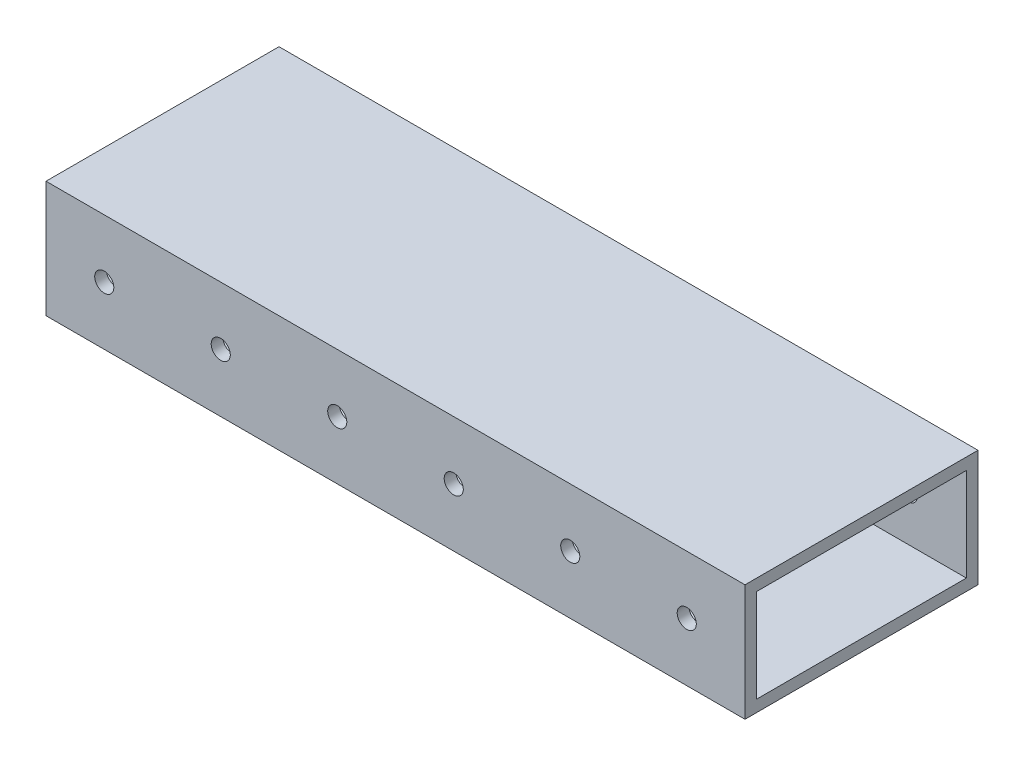
ISO-10303-21;
HEADER;
FILE_DESCRIPTION(('STEP AP214'),'2;1');
FILE_NAME('part.step','',(''),(''),'','','');
FILE_SCHEMA(('AUTOMOTIVE_DESIGN { 1 0 10303 214 1 1 1 1 }'));
ENDSEC;
DATA;
#1=APPLICATION_CONTEXT('core data for automotive mechanical design processes');
#2=APPLICATION_PROTOCOL_DEFINITION('international standard','automotive_design',2000,#1);
#3=PRODUCT_CONTEXT('',#1,'mechanical');
#4=PRODUCT('Part','Part','',(#3));
#5=PRODUCT_RELATED_PRODUCT_CATEGORY('part','',(#4));
#6=PRODUCT_DEFINITION_FORMATION('','',#4);
#7=PRODUCT_DEFINITION_CONTEXT('part definition',#1,'design');
#8=PRODUCT_DEFINITION('design','',#6,#7);
#9=PRODUCT_DEFINITION_SHAPE('','',#8);
#10=(LENGTH_UNIT() NAMED_UNIT(*) SI_UNIT(.MILLI.,.METRE.));
#11=(NAMED_UNIT(*) PLANE_ANGLE_UNIT() SI_UNIT($,.RADIAN.));
#12=(NAMED_UNIT(*) SI_UNIT($,.STERADIAN.) SOLID_ANGLE_UNIT());
#13=UNCERTAINTY_MEASURE_WITH_UNIT(LENGTH_MEASURE(1.E-05),#10,'distance_accuracy_value','');
#14=(GEOMETRIC_REPRESENTATION_CONTEXT(3) GLOBAL_UNCERTAINTY_ASSIGNED_CONTEXT((#13)) GLOBAL_UNIT_ASSIGNED_CONTEXT((#10,
#11,#12)) REPRESENTATION_CONTEXT('',''));
#15=CARTESIAN_POINT('',(0.,0.,0.));
#16=DIRECTION('',(0.,0.,1.));
#17=DIRECTION('',(1.,0.,0.));
#18=AXIS2_PLACEMENT_3D('',#15,#16,#17);
#19=CARTESIAN_POINT('',(-38.1,0.,-137.239355630794));
#20=DIRECTION('',(0.,0.,1.));
#21=DIRECTION('',(1.,0.,0.));
#22=AXIS2_PLACEMENT_3D('',#19,#20,#21);
#23=CYLINDRICAL_SURFACE('',#22,2.0828);
#24=CARTESIAN_POINT('',(-38.1,0.,22.86));
#25=DIRECTION('',(0.,0.,1.));
#26=DIRECTION('',(1.,0.,0.));
#27=AXIS2_PLACEMENT_3D('',#24,#25,#26);
#28=CIRCLE('',#27,2.0828);
#29=CARTESIAN_POINT('',(-36.0172,0.,22.86));
#30=VERTEX_POINT('',#29);
#31=EDGE_CURVE('E121',#30,#30,#28,.F.);
#32=ORIENTED_EDGE('',*,*,#31,.T.);
#33=EDGE_LOOP('',(#32));
#34=FACE_BOUND('',#33,.T.);
#35=CARTESIAN_POINT('',(-38.1,0.,25.4));
#36=DIRECTION('',(0.,0.,1.));
#37=DIRECTION('',(1.,0.,0.));
#38=AXIS2_PLACEMENT_3D('',#35,#36,#37);
#39=CIRCLE('',#38,2.0828);
#40=CARTESIAN_POINT('',(-36.0172,0.,25.4));
#41=VERTEX_POINT('',#40);
#42=EDGE_CURVE('E116',#41,#41,#39,.F.);
#43=ORIENTED_EDGE('',*,*,#42,.F.);
#44=EDGE_LOOP('',(#43));
#45=FACE_BOUND('',#44,.T.);
#46=ADVANCED_FACE('F17',(#34,#45),#23,.F.);
#47=CARTESIAN_POINT('',(12.7,0.,-137.239355630794));
#48=DIRECTION('',(0.,0.,1.));
#49=DIRECTION('',(1.,0.,0.));
#50=AXIS2_PLACEMENT_3D('',#47,#48,#49);
#51=CYLINDRICAL_SURFACE('',#50,2.0828);
#52=CARTESIAN_POINT('',(12.7,0.,22.86));
#53=DIRECTION('',(0.,0.,1.));
#54=DIRECTION('',(1.,0.,0.));
#55=AXIS2_PLACEMENT_3D('',#52,#53,#54);
#56=CIRCLE('',#55,2.0828);
#57=CARTESIAN_POINT('',(14.7828,0.,22.86));
#58=VERTEX_POINT('',#57);
#59=EDGE_CURVE('E170',#58,#58,#56,.F.);
#60=ORIENTED_EDGE('',*,*,#59,.T.);
#61=EDGE_LOOP('',(#60));
#62=FACE_BOUND('',#61,.T.);
#63=CARTESIAN_POINT('',(12.7,0.,25.4));
#64=DIRECTION('',(0.,0.,1.));
#65=DIRECTION('',(1.,0.,0.));
#66=AXIS2_PLACEMENT_3D('',#63,#64,#65);
#67=CIRCLE('',#66,2.0828);
#68=CARTESIAN_POINT('',(14.7828,0.,25.4));
#69=VERTEX_POINT('',#68);
#70=EDGE_CURVE('E154',#69,#69,#67,.F.);
#71=ORIENTED_EDGE('',*,*,#70,.F.);
#72=EDGE_LOOP('',(#71));
#73=FACE_BOUND('',#72,.T.);
#74=ADVANCED_FACE('F258',(#62,#73),#51,.F.);
#75=CARTESIAN_POINT('',(63.5,0.,-137.239355630794));
#76=DIRECTION('',(0.,0.,1.));
#77=DIRECTION('',(1.,0.,0.));
#78=AXIS2_PLACEMENT_3D('',#75,#76,#77);
#79=CYLINDRICAL_SURFACE('',#78,2.0828);
#80=CARTESIAN_POINT('',(63.5,0.,22.86));
#81=DIRECTION('',(0.,0.,1.));
#82=DIRECTION('',(1.,0.,0.));
#83=AXIS2_PLACEMENT_3D('',#80,#81,#82);
#84=CIRCLE('',#83,2.0828);
#85=CARTESIAN_POINT('',(65.5828,0.,22.86));
#86=VERTEX_POINT('',#85);
#87=EDGE_CURVE('E167',#86,#86,#84,.F.);
#88=ORIENTED_EDGE('',*,*,#87,.T.);
#89=EDGE_LOOP('',(#88));
#90=FACE_BOUND('',#89,.T.);
#91=CARTESIAN_POINT('',(63.5,0.,25.4));
#92=DIRECTION('',(0.,0.,1.));
#93=DIRECTION('',(1.,0.,0.));
#94=AXIS2_PLACEMENT_3D('',#91,#92,#93);
#95=CIRCLE('',#94,2.0828);
#96=CARTESIAN_POINT('',(65.5828,0.,25.4));
#97=VERTEX_POINT('',#96);
#98=EDGE_CURVE('E151',#97,#97,#95,.F.);
#99=ORIENTED_EDGE('',*,*,#98,.F.);
#100=EDGE_LOOP('',(#99));
#101=FACE_BOUND('',#100,.T.);
#102=ADVANCED_FACE('F264',(#90,#101),#79,.F.);
#103=CARTESIAN_POINT('',(38.1,0.,-137.239355630794));
#104=DIRECTION('',(0.,0.,1.));
#105=DIRECTION('',(1.,0.,0.));
#106=AXIS2_PLACEMENT_3D('',#103,#104,#105);
#107=CYLINDRICAL_SURFACE('',#106,2.0828);
#108=CARTESIAN_POINT('',(38.1,0.,22.86));
#109=DIRECTION('',(0.,0.,1.));
#110=DIRECTION('',(1.,0.,0.));
#111=AXIS2_PLACEMENT_3D('',#108,#109,#110);
#112=CIRCLE('',#111,2.0828);
#113=CARTESIAN_POINT('',(40.1828,0.,22.86));
#114=VERTEX_POINT('',#113);
#115=EDGE_CURVE('E164',#114,#114,#112,.F.);
#116=ORIENTED_EDGE('',*,*,#115,.T.);
#117=EDGE_LOOP('',(#116));
#118=FACE_BOUND('',#117,.T.);
#119=CARTESIAN_POINT('',(38.1,0.,25.4));
#120=DIRECTION('',(0.,0.,1.));
#121=DIRECTION('',(1.,0.,0.));
#122=AXIS2_PLACEMENT_3D('',#119,#120,#121);
#123=CIRCLE('',#122,2.0828);
#124=CARTESIAN_POINT('',(40.1828,0.,25.4));
#125=VERTEX_POINT('',#124);
#126=EDGE_CURVE('E148',#125,#125,#123,.F.);
#127=ORIENTED_EDGE('',*,*,#126,.F.);
#128=EDGE_LOOP('',(#127));
#129=FACE_BOUND('',#128,.T.);
#130=ADVANCED_FACE('F269',(#118,#129),#107,.F.);
#131=CARTESIAN_POINT('',(-12.7,0.,-137.239355630794));
#132=DIRECTION('',(0.,0.,1.));
#133=DIRECTION('',(1.,0.,0.));
#134=AXIS2_PLACEMENT_3D('',#131,#132,#133);
#135=CYLINDRICAL_SURFACE('',#134,2.0828);
#136=CARTESIAN_POINT('',(-12.7,0.,22.86));
#137=DIRECTION('',(0.,0.,1.));
#138=DIRECTION('',(1.,0.,0.));
#139=AXIS2_PLACEMENT_3D('',#136,#137,#138);
#140=CIRCLE('',#139,2.0828);
#141=CARTESIAN_POINT('',(-10.6172,0.,22.86));
#142=VERTEX_POINT('',#141);
#143=EDGE_CURVE('E161',#142,#142,#140,.F.);
#144=ORIENTED_EDGE('',*,*,#143,.T.);
#145=EDGE_LOOP('',(#144));
#146=FACE_BOUND('',#145,.T.);
#147=CARTESIAN_POINT('',(-12.7,0.,25.4));
#148=DIRECTION('',(0.,0.,1.));
#149=DIRECTION('',(1.,0.,0.));
#150=AXIS2_PLACEMENT_3D('',#147,#148,#149);
#151=CIRCLE('',#150,2.0828);
#152=CARTESIAN_POINT('',(-10.6172,0.,25.4));
#153=VERTEX_POINT('',#152);
#154=EDGE_CURVE('E145',#153,#153,#151,.F.);
#155=ORIENTED_EDGE('',*,*,#154,.F.);
#156=EDGE_LOOP('',(#155));
#157=FACE_BOUND('',#156,.T.);
#158=ADVANCED_FACE('F276',(#146,#157),#135,.F.);
#159=CARTESIAN_POINT('',(-63.5,0.,-137.239355630794));
#160=DIRECTION('',(0.,0.,1.));
#161=DIRECTION('',(1.,0.,0.));
#162=AXIS2_PLACEMENT_3D('',#159,#160,#161);
#163=CYLINDRICAL_SURFACE('',#162,2.0828);
#164=CARTESIAN_POINT('',(-63.5,0.,22.86));
#165=DIRECTION('',(0.,0.,1.));
#166=DIRECTION('',(1.,0.,0.));
#167=AXIS2_PLACEMENT_3D('',#164,#165,#166);
#168=CIRCLE('',#167,2.0828);
#169=CARTESIAN_POINT('',(-61.4172,0.,22.86));
#170=VERTEX_POINT('',#169);
#171=EDGE_CURVE('E119',#170,#170,#168,.F.);
#172=ORIENTED_EDGE('',*,*,#171,.T.);
#173=EDGE_LOOP('',(#172));
#174=FACE_BOUND('',#173,.T.);
#175=CARTESIAN_POINT('',(-63.5,0.,25.4));
#176=DIRECTION('',(0.,0.,1.));
#177=DIRECTION('',(1.,0.,0.));
#178=AXIS2_PLACEMENT_3D('',#175,#176,#177);
#179=CIRCLE('',#178,2.0828);
#180=CARTESIAN_POINT('',(-61.4172,0.,25.4));
#181=VERTEX_POINT('',#180);
#182=EDGE_CURVE('E112',#181,#181,#179,.F.);
#183=ORIENTED_EDGE('',*,*,#182,.F.);
#184=EDGE_LOOP('',(#183));
#185=FACE_BOUND('',#184,.T.);
#186=ADVANCED_FACE('F280',(#174,#185),#163,.F.);
#187=CARTESIAN_POINT('',(-38.1,0.,-137.239355630794));
#188=DIRECTION('',(0.,0.,1.));
#189=DIRECTION('',(1.,0.,0.));
#190=AXIS2_PLACEMENT_3D('',#187,#188,#189);
#191=CYLINDRICAL_SURFACE('',#190,2.0828);
#192=CARTESIAN_POINT('',(-38.1,0.,-25.4));
#193=DIRECTION('',(0.,0.,1.));
#194=DIRECTION('',(1.,0.,0.));
#195=AXIS2_PLACEMENT_3D('',#192,#193,#194);
#196=CIRCLE('',#195,2.0828);
#197=CARTESIAN_POINT('',(-36.0172,0.,-25.4));
#198=VERTEX_POINT('',#197);
#199=EDGE_CURVE('E139',#198,#198,#196,.T.);
#200=ORIENTED_EDGE('',*,*,#199,.F.);
#201=EDGE_LOOP('',(#200));
#202=FACE_BOUND('',#201,.T.);
#203=CARTESIAN_POINT('',(-38.1,0.,-22.86));
#204=DIRECTION('',(0.,0.,1.));
#205=DIRECTION('',(1.,0.,0.));
#206=AXIS2_PLACEMENT_3D('',#203,#204,#205);
#207=CIRCLE('',#206,2.0828);
#208=CARTESIAN_POINT('',(-36.0172,0.,-22.86));
#209=VERTEX_POINT('',#208);
#210=EDGE_CURVE('E20',#209,#209,#207,.T.);
#211=ORIENTED_EDGE('',*,*,#210,.T.);
#212=EDGE_LOOP('',(#211));
#213=FACE_BOUND('',#212,.T.);
#214=ADVANCED_FACE('F192',(#202,#213),#191,.F.);
#215=CARTESIAN_POINT('',(12.7,0.,-137.239355630794));
#216=DIRECTION('',(0.,0.,1.));
#217=DIRECTION('',(1.,0.,0.));
#218=AXIS2_PLACEMENT_3D('',#215,#216,#217);
#219=CYLINDRICAL_SURFACE('',#218,2.0828);
#220=CARTESIAN_POINT('',(12.7,0.,-25.4));
#221=DIRECTION('',(0.,0.,1.));
#222=DIRECTION('',(1.,0.,0.));
#223=AXIS2_PLACEMENT_3D('',#220,#221,#222);
#224=CIRCLE('',#223,2.0828);
#225=CARTESIAN_POINT('',(14.7828,0.,-25.4));
#226=VERTEX_POINT('',#225);
#227=EDGE_CURVE('E136',#226,#226,#224,.T.);
#228=ORIENTED_EDGE('',*,*,#227,.F.);
#229=EDGE_LOOP('',(#228));
#230=FACE_BOUND('',#229,.T.);
#231=CARTESIAN_POINT('',(12.7,0.,-22.86));
#232=DIRECTION('',(0.,0.,1.));
#233=DIRECTION('',(1.,0.,0.));
#234=AXIS2_PLACEMENT_3D('',#231,#232,#233);
#235=CIRCLE('',#234,2.0828);
#236=CARTESIAN_POINT('',(14.7828,0.,-22.86));
#237=VERTEX_POINT('',#236);
#238=EDGE_CURVE('E185',#237,#237,#235,.T.);
#239=ORIENTED_EDGE('',*,*,#238,.T.);
#240=EDGE_LOOP('',(#239));
#241=FACE_BOUND('',#240,.T.);
#242=ADVANCED_FACE('F287',(#230,#241),#219,.F.);
#243=CARTESIAN_POINT('',(63.5,0.,-137.239355630794));
#244=DIRECTION('',(0.,0.,1.));
#245=DIRECTION('',(1.,0.,0.));
#246=AXIS2_PLACEMENT_3D('',#243,#244,#245);
#247=CYLINDRICAL_SURFACE('',#246,2.0828);
#248=CARTESIAN_POINT('',(63.5,0.,-25.4));
#249=DIRECTION('',(0.,0.,1.));
#250=DIRECTION('',(1.,0.,0.));
#251=AXIS2_PLACEMENT_3D('',#248,#249,#250);
#252=CIRCLE('',#251,2.0828);
#253=CARTESIAN_POINT('',(65.5828,0.,-25.4));
#254=VERTEX_POINT('',#253);
#255=EDGE_CURVE('E133',#254,#254,#252,.T.);
#256=ORIENTED_EDGE('',*,*,#255,.F.);
#257=EDGE_LOOP('',(#256));
#258=FACE_BOUND('',#257,.T.);
#259=CARTESIAN_POINT('',(63.5,0.,-22.86));
#260=DIRECTION('',(0.,0.,1.));
#261=DIRECTION('',(1.,0.,0.));
#262=AXIS2_PLACEMENT_3D('',#259,#260,#261);
#263=CIRCLE('',#262,2.0828);
#264=CARTESIAN_POINT('',(65.5828,0.,-22.86));
#265=VERTEX_POINT('',#264);
#266=EDGE_CURVE('E183',#265,#265,#263,.T.);
#267=ORIENTED_EDGE('',*,*,#266,.T.);
#268=EDGE_LOOP('',(#267));
#269=FACE_BOUND('',#268,.T.);
#270=ADVANCED_FACE('F291',(#258,#269),#247,.F.);
#271=CARTESIAN_POINT('',(38.1,0.,-137.239355630794));
#272=DIRECTION('',(0.,0.,1.));
#273=DIRECTION('',(1.,0.,0.));
#274=AXIS2_PLACEMENT_3D('',#271,#272,#273);
#275=CYLINDRICAL_SURFACE('',#274,2.0828);
#276=CARTESIAN_POINT('',(38.1,0.,-25.4));
#277=DIRECTION('',(0.,0.,1.));
#278=DIRECTION('',(1.,0.,0.));
#279=AXIS2_PLACEMENT_3D('',#276,#277,#278);
#280=CIRCLE('',#279,2.0828);
#281=CARTESIAN_POINT('',(40.1828,0.,-25.4));
#282=VERTEX_POINT('',#281);
#283=EDGE_CURVE('E130',#282,#282,#280,.T.);
#284=ORIENTED_EDGE('',*,*,#283,.F.);
#285=EDGE_LOOP('',(#284));
#286=FACE_BOUND('',#285,.T.);
#287=CARTESIAN_POINT('',(38.1,0.,-22.86));
#288=DIRECTION('',(0.,0.,1.));
#289=DIRECTION('',(1.,0.,0.));
#290=AXIS2_PLACEMENT_3D('',#287,#288,#289);
#291=CIRCLE('',#290,2.0828);
#292=CARTESIAN_POINT('',(40.1828,0.,-22.86));
#293=VERTEX_POINT('',#292);
#294=EDGE_CURVE('E180',#293,#293,#291,.T.);
#295=ORIENTED_EDGE('',*,*,#294,.T.);
#296=EDGE_LOOP('',(#295));
#297=FACE_BOUND('',#296,.T.);
#298=ADVANCED_FACE('F295',(#286,#297),#275,.F.);
#299=CARTESIAN_POINT('',(-12.7,0.,-137.239355630794));
#300=DIRECTION('',(0.,0.,1.));
#301=DIRECTION('',(1.,0.,0.));
#302=AXIS2_PLACEMENT_3D('',#299,#300,#301);
#303=CYLINDRICAL_SURFACE('',#302,2.0828);
#304=CARTESIAN_POINT('',(-12.7,0.,-25.4));
#305=DIRECTION('',(0.,0.,1.));
#306=DIRECTION('',(1.,0.,0.));
#307=AXIS2_PLACEMENT_3D('',#304,#305,#306);
#308=CIRCLE('',#307,2.0828);
#309=CARTESIAN_POINT('',(-10.6172,0.,-25.4));
#310=VERTEX_POINT('',#309);
#311=EDGE_CURVE('E127',#310,#310,#308,.T.);
#312=ORIENTED_EDGE('',*,*,#311,.F.);
#313=EDGE_LOOP('',(#312));
#314=FACE_BOUND('',#313,.T.);
#315=CARTESIAN_POINT('',(-12.7,0.,-22.86));
#316=DIRECTION('',(0.,0.,1.));
#317=DIRECTION('',(1.,0.,0.));
#318=AXIS2_PLACEMENT_3D('',#315,#316,#317);
#319=CIRCLE('',#318,2.0828);
#320=CARTESIAN_POINT('',(-10.6172,0.,-22.86));
#321=VERTEX_POINT('',#320);
#322=EDGE_CURVE('E177',#321,#321,#319,.T.);
#323=ORIENTED_EDGE('',*,*,#322,.T.);
#324=EDGE_LOOP('',(#323));
#325=FACE_BOUND('',#324,.T.);
#326=ADVANCED_FACE('F206',(#314,#325),#303,.F.);
#327=CARTESIAN_POINT('',(-63.5,0.,-137.239355630794));
#328=DIRECTION('',(0.,0.,1.));
#329=DIRECTION('',(1.,0.,0.));
#330=AXIS2_PLACEMENT_3D('',#327,#328,#329);
#331=CYLINDRICAL_SURFACE('',#330,2.0828);
#332=CARTESIAN_POINT('',(-63.5,0.,-25.4));
#333=DIRECTION('',(0.,0.,1.));
#334=DIRECTION('',(1.,0.,0.));
#335=AXIS2_PLACEMENT_3D('',#332,#333,#334);
#336=CIRCLE('',#335,2.0828);
#337=CARTESIAN_POINT('',(-61.4172,0.,-25.4));
#338=VERTEX_POINT('',#337);
#339=EDGE_CURVE('E123',#338,#338,#336,.T.);
#340=ORIENTED_EDGE('',*,*,#339,.F.);
#341=EDGE_LOOP('',(#340));
#342=FACE_BOUND('',#341,.T.);
#343=CARTESIAN_POINT('',(-63.5,0.,-22.86));
#344=DIRECTION('',(0.,0.,1.));
#345=DIRECTION('',(1.,0.,0.));
#346=AXIS2_PLACEMENT_3D('',#343,#344,#345);
#347=CIRCLE('',#346,2.0828);
#348=CARTESIAN_POINT('',(-61.4172,0.,-22.86));
#349=VERTEX_POINT('',#348);
#350=EDGE_CURVE('E122',#349,#349,#347,.T.);
#351=ORIENTED_EDGE('',*,*,#350,.T.);
#352=EDGE_LOOP('',(#351));
#353=FACE_BOUND('',#352,.T.);
#354=ADVANCED_FACE('F196',(#342,#353),#331,.F.);
#355=CARTESIAN_POINT('',(0.,-10.1600000000001,-22.86));
#356=DIRECTION('',(0.,0.,-1.));
#357=DIRECTION('',(-1.,0.,0.));
#358=AXIS2_PLACEMENT_3D('',#355,#356,#357);
#359=PLANE('',#358);
#360=DIRECTION('',(0.,1.,0.));
#361=VECTOR('',#360,1.);
#362=CARTESIAN_POINT('',(-76.2,0.,-22.86));
#363=LINE('',#362,#361);
#364=CARTESIAN_POINT('',(-76.2,10.1600000000001,-22.86));
#365=VERTEX_POINT('',#364);
#366=CARTESIAN_POINT('',(-76.2,-10.1600000000001,-22.86));
#367=VERTEX_POINT('',#366);
#368=EDGE_CURVE('E469',#365,#367,#363,.F.);
#369=ORIENTED_EDGE('',*,*,#368,.T.);
#370=DIRECTION('',(1.,0.,0.));
#371=VECTOR('',#370,1.);
#372=CARTESIAN_POINT('',(0.,-10.1600000000001,-22.86));
#373=LINE('',#372,#371);
#374=CARTESIAN_POINT('',(76.2,-10.1600000000001,-22.86));
#375=VERTEX_POINT('',#374);
#376=EDGE_CURVE('E102',#367,#375,#373,.T.);
#377=ORIENTED_EDGE('',*,*,#376,.T.);
#378=DIRECTION('',(0.,1.,0.));
#379=VECTOR('',#378,1.);
#380=CARTESIAN_POINT('',(76.2,0.,-22.86));
#381=LINE('',#380,#379);
#382=CARTESIAN_POINT('',(76.2,10.1600000000001,-22.86));
#383=VERTEX_POINT('',#382);
#384=EDGE_CURVE('E98',#383,#375,#381,.F.);
#385=ORIENTED_EDGE('',*,*,#384,.F.);
#386=DIRECTION('',(1.,0.,0.));
#387=VECTOR('',#386,1.);
#388=CARTESIAN_POINT('',(0.,10.1600000000001,-22.86));
#389=LINE('',#388,#387);
#390=EDGE_CURVE('E85',#383,#365,#389,.F.);
#391=ORIENTED_EDGE('',*,*,#390,.T.);
#392=EDGE_LOOP('',(#369,#377,#385,#391));
#393=FACE_BOUND('',#392,.T.);
#394=ORIENTED_EDGE('',*,*,#350,.F.);
#395=EDGE_LOOP('',(#394));
#396=FACE_BOUND('',#395,.T.);
#397=ORIENTED_EDGE('',*,*,#322,.F.);
#398=EDGE_LOOP('',(#397));
#399=FACE_BOUND('',#398,.T.);
#400=ORIENTED_EDGE('',*,*,#294,.F.);
#401=EDGE_LOOP('',(#400));
#402=FACE_BOUND('',#401,.T.);
#403=ORIENTED_EDGE('',*,*,#266,.F.);
#404=EDGE_LOOP('',(#403));
#405=FACE_BOUND('',#404,.T.);
#406=ORIENTED_EDGE('',*,*,#238,.F.);
#407=EDGE_LOOP('',(#406));
#408=FACE_BOUND('',#407,.T.);
#409=ORIENTED_EDGE('',*,*,#210,.F.);
#410=EDGE_LOOP('',(#409));
#411=FACE_BOUND('',#410,.T.);
#412=ADVANCED_FACE('F99',(#393,#396,#399,#402,#405,#408,#411),#359,.F.);
#413=CARTESIAN_POINT('',(0.,-10.1600000000001,22.86));
#414=DIRECTION('',(0.,-1.,0.));
#415=DIRECTION('',(0.,0.,-1.));
#416=AXIS2_PLACEMENT_3D('',#413,#414,#415);
#417=PLANE('',#416);
#418=DIRECTION('',(0.,0.,-1.));
#419=VECTOR('',#418,1.);
#420=CARTESIAN_POINT('',(-76.2,-10.1600000000001,0.));
#421=LINE('',#420,#419);
#422=CARTESIAN_POINT('',(-76.2,-10.1600000000001,22.86));
#423=VERTEX_POINT('',#422);
#424=EDGE_CURVE('E467',#367,#423,#421,.F.);
#425=ORIENTED_EDGE('',*,*,#424,.T.);
#426=DIRECTION('',(1.,0.,0.));
#427=VECTOR('',#426,1.);
#428=CARTESIAN_POINT('',(0.,-10.1600000000001,22.86));
#429=LINE('',#428,#427);
#430=CARTESIAN_POINT('',(76.2,-10.1600000000001,22.86));
#431=VERTEX_POINT('',#430);
#432=EDGE_CURVE('E95',#423,#431,#429,.T.);
#433=ORIENTED_EDGE('',*,*,#432,.T.);
#434=DIRECTION('',(0.,0.,-1.));
#435=VECTOR('',#434,1.);
#436=CARTESIAN_POINT('',(76.2,-10.1600000000001,0.));
#437=LINE('',#436,#435);
#438=EDGE_CURVE('E106',#375,#431,#437,.F.);
#439=ORIENTED_EDGE('',*,*,#438,.F.);
#440=ORIENTED_EDGE('',*,*,#376,.F.);
#441=EDGE_LOOP('',(#425,#433,#439,#440));
#442=FACE_BOUND('',#441,.T.);
#443=ADVANCED_FACE('F195',(#442),#417,.F.);
#444=CARTESIAN_POINT('',(0.,10.1600000000001,22.86));
#445=DIRECTION('',(0.,0.,1.));
#446=DIRECTION('',(1.,0.,0.));
#447=AXIS2_PLACEMENT_3D('',#444,#445,#446);
#448=PLANE('',#447);
#449=DIRECTION('',(0.,1.,0.));
#450=VECTOR('',#449,1.);
#451=CARTESIAN_POINT('',(-76.2,0.,22.86));
#452=LINE('',#451,#450);
#453=CARTESIAN_POINT('',(-76.2,10.1600000000001,22.86));
#454=VERTEX_POINT('',#453);
#455=EDGE_CURVE('E243',#423,#454,#452,.T.);
#456=ORIENTED_EDGE('',*,*,#455,.T.);
#457=DIRECTION('',(1.,0.,0.));
#458=VECTOR('',#457,1.);
#459=CARTESIAN_POINT('',(0.,10.1600000000001,22.86));
#460=LINE('',#459,#458);
#461=CARTESIAN_POINT('',(76.2,10.1600000000001,22.86));
#462=VERTEX_POINT('',#461);
#463=EDGE_CURVE('E80',#454,#462,#460,.T.);
#464=ORIENTED_EDGE('',*,*,#463,.T.);
#465=DIRECTION('',(0.,1.,0.));
#466=VECTOR('',#465,1.);
#467=CARTESIAN_POINT('',(76.2,0.,22.86));
#468=LINE('',#467,#466);
#469=EDGE_CURVE('E109',#431,#462,#468,.T.);
#470=ORIENTED_EDGE('',*,*,#469,.F.);
#471=ORIENTED_EDGE('',*,*,#432,.F.);
#472=EDGE_LOOP('',(#456,#464,#470,#471));
#473=FACE_BOUND('',#472,.T.);
#474=ORIENTED_EDGE('',*,*,#171,.F.);
#475=EDGE_LOOP('',(#474));
#476=FACE_BOUND('',#475,.T.);
#477=ORIENTED_EDGE('',*,*,#143,.F.);
#478=EDGE_LOOP('',(#477));
#479=FACE_BOUND('',#478,.T.);
#480=ORIENTED_EDGE('',*,*,#115,.F.);
#481=EDGE_LOOP('',(#480));
#482=FACE_BOUND('',#481,.T.);
#483=ORIENTED_EDGE('',*,*,#87,.F.);
#484=EDGE_LOOP('',(#483));
#485=FACE_BOUND('',#484,.T.);
#486=ORIENTED_EDGE('',*,*,#59,.F.);
#487=EDGE_LOOP('',(#486));
#488=FACE_BOUND('',#487,.T.);
#489=ORIENTED_EDGE('',*,*,#31,.F.);
#490=EDGE_LOOP('',(#489));
#491=FACE_BOUND('',#490,.T.);
#492=ADVANCED_FACE('F203',(#473,#476,#479,#482,#485,#488,#491),#448,.F.);
#493=CARTESIAN_POINT('',(0.,10.1600000000001,-22.86));
#494=DIRECTION('',(0.,1.,0.));
#495=DIRECTION('',(0.,0.,1.));
#496=AXIS2_PLACEMENT_3D('',#493,#494,#495);
#497=PLANE('',#496);
#498=DIRECTION('',(0.,0.,-1.));
#499=VECTOR('',#498,1.);
#500=CARTESIAN_POINT('',(-76.2,10.1600000000001,0.));
#501=LINE('',#500,#499);
#502=EDGE_CURVE('E92',#454,#365,#501,.T.);
#503=ORIENTED_EDGE('',*,*,#502,.T.);
#504=ORIENTED_EDGE('',*,*,#390,.F.);
#505=DIRECTION('',(0.,0.,-1.));
#506=VECTOR('',#505,1.);
#507=CARTESIAN_POINT('',(76.2,10.1600000000001,0.));
#508=LINE('',#507,#506);
#509=EDGE_CURVE('E89',#462,#383,#508,.T.);
#510=ORIENTED_EDGE('',*,*,#509,.F.);
#511=ORIENTED_EDGE('',*,*,#463,.F.);
#512=EDGE_LOOP('',(#503,#504,#510,#511));
#513=FACE_BOUND('',#512,.T.);
#514=ADVANCED_FACE('F87',(#513),#497,.F.);
#515=CARTESIAN_POINT('',(0.,-12.7,25.4));
#516=DIRECTION('',(0.,-1.,0.));
#517=DIRECTION('',(0.,0.,-1.));
#518=AXIS2_PLACEMENT_3D('',#515,#516,#517);
#519=PLANE('',#518);
#520=DIRECTION('',(1.,0.,0.));
#521=VECTOR('',#520,1.);
#522=CARTESIAN_POINT('',(0.,-12.7,25.4));
#523=LINE('',#522,#521);
#524=CARTESIAN_POINT('',(-76.2,-12.7,25.4));
#525=VERTEX_POINT('',#524);
#526=CARTESIAN_POINT('',(76.2,-12.7,25.4));
#527=VERTEX_POINT('',#526);
#528=EDGE_CURVE('E110',#525,#527,#523,.T.);
#529=ORIENTED_EDGE('',*,*,#528,.F.);
#530=DIRECTION('',(0.,0.,-1.));
#531=VECTOR('',#530,1.);
#532=CARTESIAN_POINT('',(-76.2,-12.7,0.));
#533=LINE('',#532,#531);
#534=CARTESIAN_POINT('',(-76.2,-12.7,-25.4));
#535=VERTEX_POINT('',#534);
#536=EDGE_CURVE('E470',#525,#535,#533,.T.);
#537=ORIENTED_EDGE('',*,*,#536,.T.);
#538=DIRECTION('',(-1.,0.,0.));
#539=VECTOR('',#538,1.);
#540=CARTESIAN_POINT('',(0.,-12.7,-25.4));
#541=LINE('',#540,#539);
#542=CARTESIAN_POINT('',(76.2,-12.7,-25.4));
#543=VERTEX_POINT('',#542);
#544=EDGE_CURVE('E477',#543,#535,#541,.T.);
#545=ORIENTED_EDGE('',*,*,#544,.F.);
#546=DIRECTION('',(0.,0.,-1.));
#547=VECTOR('',#546,1.);
#548=CARTESIAN_POINT('',(76.2,-12.7,0.));
#549=LINE('',#548,#547);
#550=EDGE_CURVE('E142',#527,#543,#549,.T.);
#551=ORIENTED_EDGE('',*,*,#550,.F.);
#552=EDGE_LOOP('',(#529,#537,#545,#551));
#553=FACE_BOUND('',#552,.T.);
#554=ADVANCED_FACE('F230',(#553),#519,.T.);
#555=CARTESIAN_POINT('',(0.,12.7,25.4));
#556=DIRECTION('',(0.,0.,1.));
#557=DIRECTION('',(1.,0.,0.));
#558=AXIS2_PLACEMENT_3D('',#555,#556,#557);
#559=PLANE('',#558);
#560=DIRECTION('',(1.,0.,0.));
#561=VECTOR('',#560,1.);
#562=CARTESIAN_POINT('',(0.,12.7,25.4));
#563=LINE('',#562,#561);
#564=CARTESIAN_POINT('',(-76.2,12.7,25.4));
#565=VERTEX_POINT('',#564);
#566=CARTESIAN_POINT('',(76.2,12.7,25.4));
#567=VERTEX_POINT('',#566);
#568=EDGE_CURVE('E492',#565,#567,#563,.T.);
#569=ORIENTED_EDGE('',*,*,#568,.F.);
#570=DIRECTION('',(0.,1.,0.));
#571=VECTOR('',#570,1.);
#572=CARTESIAN_POINT('',(-76.2,0.,25.4));
#573=LINE('',#572,#571);
#574=EDGE_CURVE('E494',#565,#525,#573,.F.);
#575=ORIENTED_EDGE('',*,*,#574,.T.);
#576=ORIENTED_EDGE('',*,*,#528,.T.);
#577=DIRECTION('',(0.,1.,0.));
#578=VECTOR('',#577,1.);
#579=CARTESIAN_POINT('',(76.2,0.,25.4));
#580=LINE('',#579,#578);
#581=EDGE_CURVE('E482',#567,#527,#580,.F.);
#582=ORIENTED_EDGE('',*,*,#581,.F.);
#583=EDGE_LOOP('',(#569,#575,#576,#582));
#584=FACE_BOUND('',#583,.T.);
#585=ORIENTED_EDGE('',*,*,#182,.T.);
#586=EDGE_LOOP('',(#585));
#587=FACE_BOUND('',#586,.T.);
#588=ORIENTED_EDGE('',*,*,#154,.T.);
#589=EDGE_LOOP('',(#588));
#590=FACE_BOUND('',#589,.T.);
#591=ORIENTED_EDGE('',*,*,#126,.T.);
#592=EDGE_LOOP('',(#591));
#593=FACE_BOUND('',#592,.T.);
#594=ORIENTED_EDGE('',*,*,#98,.T.);
#595=EDGE_LOOP('',(#594));
#596=FACE_BOUND('',#595,.T.);
#597=ORIENTED_EDGE('',*,*,#70,.T.);
#598=EDGE_LOOP('',(#597));
#599=FACE_BOUND('',#598,.T.);
#600=ORIENTED_EDGE('',*,*,#42,.T.);
#601=EDGE_LOOP('',(#600));
#602=FACE_BOUND('',#601,.T.);
#603=ADVANCED_FACE('F226',(#584,#587,#590,#593,#596,#599,#602),#559,.T.);
#604=CARTESIAN_POINT('',(76.2,0.,0.));
#605=DIRECTION('',(1.,0.,0.));
#606=DIRECTION('',(0.,0.,-1.));
#607=AXIS2_PLACEMENT_3D('',#604,#605,#606);
#608=PLANE('',#607);
#609=DIRECTION('',(0.,1.,0.));
#610=VECTOR('',#609,1.);
#611=CARTESIAN_POINT('',(76.2,-12.7,-25.4));
#612=LINE('',#611,#610);
#613=CARTESIAN_POINT('',(76.2,12.7,-25.4));
#614=VERTEX_POINT('',#613);
#615=EDGE_CURVE('E126',#614,#543,#612,.F.);
#616=ORIENTED_EDGE('',*,*,#615,.F.);
#617=DIRECTION('',(0.,0.,1.));
#618=VECTOR('',#617,1.);
#619=CARTESIAN_POINT('',(76.2,12.7,-25.4));
#620=LINE('',#619,#618);
#621=EDGE_CURVE('E489',#567,#614,#620,.F.);
#622=ORIENTED_EDGE('',*,*,#621,.F.);
#623=ORIENTED_EDGE('',*,*,#581,.T.);
#624=ORIENTED_EDGE('',*,*,#550,.T.);
#625=EDGE_LOOP('',(#616,#622,#623,#624));
#626=FACE_BOUND('',#625,.T.);
#627=ORIENTED_EDGE('',*,*,#438,.T.);
#628=ORIENTED_EDGE('',*,*,#469,.T.);
#629=ORIENTED_EDGE('',*,*,#509,.T.);
#630=ORIENTED_EDGE('',*,*,#384,.T.);
#631=EDGE_LOOP('',(#627,#628,#629,#630));
#632=FACE_BOUND('',#631,.T.);
#633=ADVANCED_FACE('F108',(#626,#632),#608,.T.);
#634=CARTESIAN_POINT('',(0.,-12.7,-25.4));
#635=DIRECTION('',(0.,0.,-1.));
#636=DIRECTION('',(-1.,0.,0.));
#637=AXIS2_PLACEMENT_3D('',#634,#635,#636);
#638=PLANE('',#637);
#639=ORIENTED_EDGE('',*,*,#544,.T.);
#640=DIRECTION('',(0.,1.,0.));
#641=VECTOR('',#640,1.);
#642=CARTESIAN_POINT('',(-76.2,0.,-25.4));
#643=LINE('',#642,#641);
#644=CARTESIAN_POINT('',(-76.2,12.7,-25.4));
#645=VERTEX_POINT('',#644);
#646=EDGE_CURVE('E35',#535,#645,#643,.T.);
#647=ORIENTED_EDGE('',*,*,#646,.T.);
#648=DIRECTION('',(1.,0.,0.));
#649=VECTOR('',#648,1.);
#650=CARTESIAN_POINT('',(0.,12.7,-25.4));
#651=LINE('',#650,#649);
#652=EDGE_CURVE('E26',#614,#645,#651,.F.);
#653=ORIENTED_EDGE('',*,*,#652,.F.);
#654=ORIENTED_EDGE('',*,*,#615,.T.);
#655=EDGE_LOOP('',(#639,#647,#653,#654));
#656=FACE_BOUND('',#655,.T.);
#657=ORIENTED_EDGE('',*,*,#339,.T.);
#658=EDGE_LOOP('',(#657));
#659=FACE_BOUND('',#658,.T.);
#660=ORIENTED_EDGE('',*,*,#311,.T.);
#661=EDGE_LOOP('',(#660));
#662=FACE_BOUND('',#661,.T.);
#663=ORIENTED_EDGE('',*,*,#283,.T.);
#664=EDGE_LOOP('',(#663));
#665=FACE_BOUND('',#664,.T.);
#666=ORIENTED_EDGE('',*,*,#255,.T.);
#667=EDGE_LOOP('',(#666));
#668=FACE_BOUND('',#667,.T.);
#669=ORIENTED_EDGE('',*,*,#227,.T.);
#670=EDGE_LOOP('',(#669));
#671=FACE_BOUND('',#670,.T.);
#672=ORIENTED_EDGE('',*,*,#199,.T.);
#673=EDGE_LOOP('',(#672));
#674=FACE_BOUND('',#673,.T.);
#675=ADVANCED_FACE('F217',(#656,#659,#662,#665,#668,#671,#674),#638,.T.);
#676=CARTESIAN_POINT('',(-76.2,0.,0.));
#677=DIRECTION('',(1.,0.,0.));
#678=DIRECTION('',(0.,0.,-1.));
#679=AXIS2_PLACEMENT_3D('',#676,#677,#678);
#680=PLANE('',#679);
#681=DIRECTION('',(0.,0.,1.));
#682=VECTOR('',#681,1.);
#683=CARTESIAN_POINT('',(-76.2,12.7,-25.4));
#684=LINE('',#683,#682);
#685=EDGE_CURVE('E11',#645,#565,#684,.T.);
#686=ORIENTED_EDGE('',*,*,#685,.F.);
#687=ORIENTED_EDGE('',*,*,#646,.F.);
#688=ORIENTED_EDGE('',*,*,#536,.F.);
#689=ORIENTED_EDGE('',*,*,#574,.F.);
#690=EDGE_LOOP('',(#686,#687,#688,#689));
#691=FACE_BOUND('',#690,.T.);
#692=ORIENTED_EDGE('',*,*,#455,.F.);
#693=ORIENTED_EDGE('',*,*,#424,.F.);
#694=ORIENTED_EDGE('',*,*,#368,.F.);
#695=ORIENTED_EDGE('',*,*,#502,.F.);
#696=EDGE_LOOP('',(#692,#693,#694,#695));
#697=FACE_BOUND('',#696,.T.);
#698=ADVANCED_FACE('F211',(#691,#697),#680,.F.);
#699=CARTESIAN_POINT('',(0.,12.7,-25.4));
#700=DIRECTION('',(0.,1.,0.));
#701=DIRECTION('',(0.,0.,1.));
#702=AXIS2_PLACEMENT_3D('',#699,#700,#701);
#703=PLANE('',#702);
#704=ORIENTED_EDGE('',*,*,#652,.T.);
#705=ORIENTED_EDGE('',*,*,#685,.T.);
#706=ORIENTED_EDGE('',*,*,#568,.T.);
#707=ORIENTED_EDGE('',*,*,#621,.T.);
#708=EDGE_LOOP('',(#704,#705,#706,#707));
#709=FACE_BOUND('',#708,.T.);
#710=ADVANCED_FACE('F209',(#709),#703,.T.);
#711=CLOSED_SHELL('',(#46,#74,#102,#130,#158,#186,#214,#242,#270,#298,#326,#354,#412,#443,#492,
#514,#554,#603,#633,#675,#698,#710));
#712=MANIFOLD_SOLID_BREP('B1',#711);
#713=ADVANCED_BREP_SHAPE_REPRESENTATION('',(#18,#712),#14);
#714=SHAPE_DEFINITION_REPRESENTATION(#9,#713);
ENDSEC;
END-ISO-10303-21;
